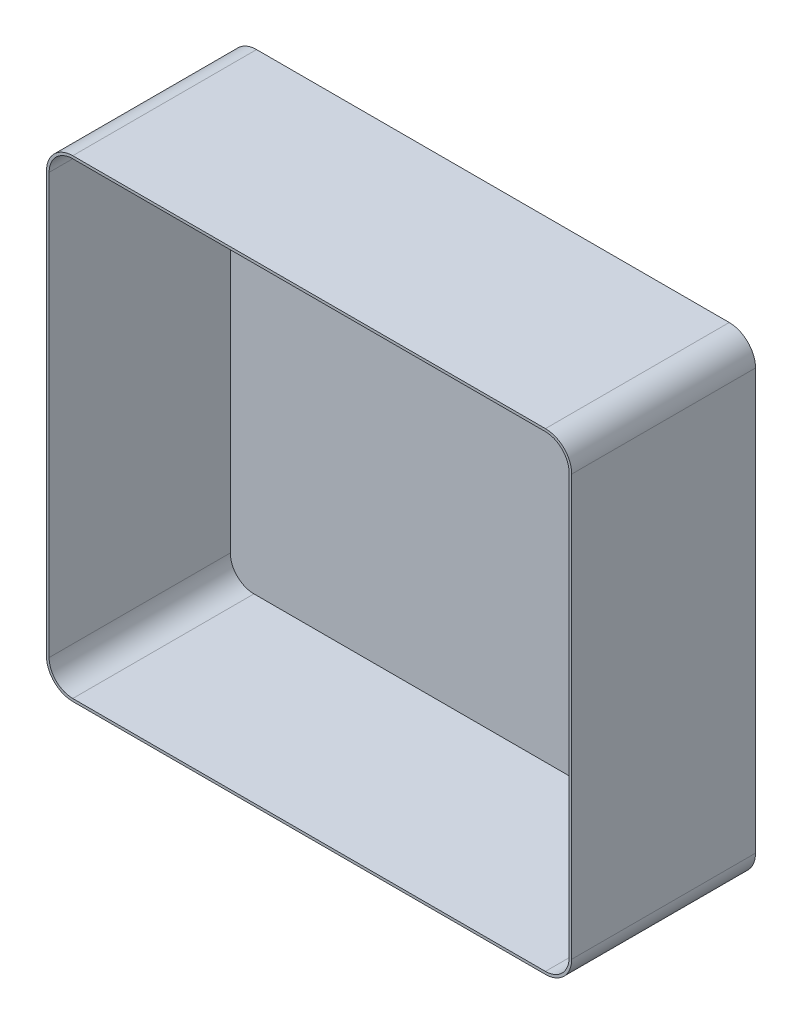
ISO-10303-21;
HEADER;
FILE_DESCRIPTION(('STEP AP214'),'2;1');
FILE_NAME('part.step','',(''),(''),'','','');
FILE_SCHEMA(('AUTOMOTIVE_DESIGN { 1 0 10303 214 1 1 1 1 }'));
ENDSEC;
DATA;
#1=APPLICATION_CONTEXT('core data for automotive mechanical design processes');
#2=APPLICATION_PROTOCOL_DEFINITION('international standard','automotive_design',2000,#1);
#3=PRODUCT_CONTEXT('',#1,'mechanical');
#4=PRODUCT('Part','Part','',(#3));
#5=PRODUCT_RELATED_PRODUCT_CATEGORY('part','',(#4));
#6=PRODUCT_DEFINITION_FORMATION('','',#4);
#7=PRODUCT_DEFINITION_CONTEXT('part definition',#1,'design');
#8=PRODUCT_DEFINITION('design','',#6,#7);
#9=PRODUCT_DEFINITION_SHAPE('','',#8);
#10=(LENGTH_UNIT() NAMED_UNIT(*) SI_UNIT(.MILLI.,.METRE.));
#11=(NAMED_UNIT(*) PLANE_ANGLE_UNIT() SI_UNIT($,.RADIAN.));
#12=(NAMED_UNIT(*) SI_UNIT($,.STERADIAN.) SOLID_ANGLE_UNIT());
#13=UNCERTAINTY_MEASURE_WITH_UNIT(LENGTH_MEASURE(1.E-05),#10,'distance_accuracy_value','');
#14=(GEOMETRIC_REPRESENTATION_CONTEXT(3) GLOBAL_UNCERTAINTY_ASSIGNED_CONTEXT((#13)) GLOBAL_UNIT_ASSIGNED_CONTEXT((#10,
#11,#12)) REPRESENTATION_CONTEXT('',''));
#15=CARTESIAN_POINT('',(0.,0.,0.));
#16=DIRECTION('',(0.,0.,1.));
#17=DIRECTION('',(1.,0.,0.));
#18=AXIS2_PLACEMENT_3D('',#15,#16,#17);
#19=CARTESIAN_POINT('',(90.,-80.,70.));
#20=DIRECTION('',(0.,0.,-1.));
#21=DIRECTION('',(-1.,0.,0.));
#22=AXIS2_PLACEMENT_3D('',#19,#20,#21);
#23=CYLINDRICAL_SURFACE('',#22,9.99999999999999);
#24=CARTESIAN_POINT('',(90.,-80.,0.));
#25=DIRECTION('',(0.,0.,1.));
#26=DIRECTION('',(1.,0.,0.));
#27=AXIS2_PLACEMENT_3D('',#24,#25,#26);
#28=CIRCLE('',#27,9.99999999999999);
#29=CARTESIAN_POINT('',(89.9999999999999,-90.,0.));
#30=VERTEX_POINT('',#29);
#31=CARTESIAN_POINT('',(100.,-79.9999999999999,0.));
#32=VERTEX_POINT('',#31);
#33=EDGE_CURVE('E153',#30,#32,#28,.T.);
#34=ORIENTED_EDGE('',*,*,#33,.T.);
#35=DIRECTION('',(0.,0.,-1.));
#36=VECTOR('',#35,1.);
#37=CARTESIAN_POINT('',(100.,-79.9999999999999,70.));
#38=LINE('',#37,#36);
#39=CARTESIAN_POINT('',(100.,-79.9999999999999,70.));
#40=VERTEX_POINT('',#39);
#41=EDGE_CURVE('E11',#40,#32,#38,.T.);
#42=ORIENTED_EDGE('',*,*,#41,.F.);
#43=CARTESIAN_POINT('',(90.,-80.,70.));
#44=DIRECTION('',(0.,0.,1.));
#45=DIRECTION('',(1.,0.,0.));
#46=AXIS2_PLACEMENT_3D('',#43,#44,#45);
#47=CIRCLE('',#46,9.99999999999999);
#48=CARTESIAN_POINT('',(89.9999999999999,-90.,70.));
#49=VERTEX_POINT('',#48);
#50=EDGE_CURVE('E181',#49,#40,#47,.T.);
#51=ORIENTED_EDGE('',*,*,#50,.F.);
#52=DIRECTION('',(0.,0.,-1.));
#53=VECTOR('',#52,1.);
#54=CARTESIAN_POINT('',(89.9999999999999,-90.,70.));
#55=LINE('',#54,#53);
#56=EDGE_CURVE('E149',#49,#30,#55,.T.);
#57=ORIENTED_EDGE('',*,*,#56,.T.);
#58=EDGE_LOOP('',(#34,#42,#51,#57));
#59=FACE_BOUND('',#58,.T.);
#60=ADVANCED_FACE('F41',(#59),#23,.T.);
#61=CARTESIAN_POINT('',(100.,0.,70.));
#62=DIRECTION('',(-1.,0.,0.));
#63=DIRECTION('',(0.,-1.,0.));
#64=AXIS2_PLACEMENT_3D('',#61,#62,#63);
#65=PLANE('',#64);
#66=DIRECTION('',(0.,1.,0.));
#67=VECTOR('',#66,1.);
#68=CARTESIAN_POINT('',(100.,0.,0.));
#69=LINE('',#68,#67);
#70=CARTESIAN_POINT('',(100.,79.9999999999999,0.));
#71=VERTEX_POINT('',#70);
#72=EDGE_CURVE('E157',#32,#71,#69,.T.);
#73=ORIENTED_EDGE('',*,*,#72,.T.);
#74=DIRECTION('',(0.,0.,-1.));
#75=VECTOR('',#74,1.);
#76=CARTESIAN_POINT('',(100.,79.9999999999999,70.));
#77=LINE('',#76,#75);
#78=CARTESIAN_POINT('',(100.,79.9999999999999,70.));
#79=VERTEX_POINT('',#78);
#80=EDGE_CURVE('E49',#79,#71,#77,.T.);
#81=ORIENTED_EDGE('',*,*,#80,.F.);
#82=DIRECTION('',(0.,1.,0.));
#83=VECTOR('',#82,1.);
#84=CARTESIAN_POINT('',(100.,0.,70.));
#85=LINE('',#84,#83);
#86=EDGE_CURVE('E106',#40,#79,#85,.T.);
#87=ORIENTED_EDGE('',*,*,#86,.F.);
#88=ORIENTED_EDGE('',*,*,#41,.T.);
#89=EDGE_LOOP('',(#73,#81,#87,#88));
#90=FACE_BOUND('',#89,.T.);
#91=ADVANCED_FACE('F200',(#90),#65,.F.);
#92=CARTESIAN_POINT('',(90.,80.,70.));
#93=DIRECTION('',(0.,0.,-1.));
#94=DIRECTION('',(-1.,0.,0.));
#95=AXIS2_PLACEMENT_3D('',#92,#93,#94);
#96=CYLINDRICAL_SURFACE('',#95,9.99999999999999);
#97=CARTESIAN_POINT('',(90.,80.,0.));
#98=DIRECTION('',(0.,0.,1.));
#99=DIRECTION('',(1.,0.,0.));
#100=AXIS2_PLACEMENT_3D('',#97,#98,#99);
#101=CIRCLE('',#100,9.99999999999999);
#102=CARTESIAN_POINT('',(89.9999999999999,90.,0.));
#103=VERTEX_POINT('',#102);
#104=EDGE_CURVE('E162',#103,#71,#101,.F.);
#105=ORIENTED_EDGE('',*,*,#104,.F.);
#106=DIRECTION('',(0.,0.,-1.));
#107=VECTOR('',#106,1.);
#108=CARTESIAN_POINT('',(89.9999999999999,90.,70.));
#109=LINE('',#108,#107);
#110=CARTESIAN_POINT('',(89.9999999999999,90.,70.));
#111=VERTEX_POINT('',#110);
#112=EDGE_CURVE('E191',#111,#103,#109,.T.);
#113=ORIENTED_EDGE('',*,*,#112,.F.);
#114=CARTESIAN_POINT('',(90.,80.,70.));
#115=DIRECTION('',(0.,0.,1.));
#116=DIRECTION('',(1.,0.,0.));
#117=AXIS2_PLACEMENT_3D('',#114,#115,#116);
#118=CIRCLE('',#117,9.99999999999999);
#119=EDGE_CURVE('E199',#111,#79,#118,.F.);
#120=ORIENTED_EDGE('',*,*,#119,.T.);
#121=ORIENTED_EDGE('',*,*,#80,.T.);
#122=EDGE_LOOP('',(#105,#113,#120,#121));
#123=FACE_BOUND('',#122,.T.);
#124=ADVANCED_FACE('F197',(#123),#96,.T.);
#125=CARTESIAN_POINT('',(0.,90.,70.));
#126=DIRECTION('',(0.,1.,0.));
#127=DIRECTION('',(0.,0.,1.));
#128=AXIS2_PLACEMENT_3D('',#125,#126,#127);
#129=PLANE('',#128);
#130=DIRECTION('',(1.,0.,0.));
#131=VECTOR('',#130,1.);
#132=CARTESIAN_POINT('',(0.,90.,0.));
#133=LINE('',#132,#131);
#134=CARTESIAN_POINT('',(-89.9999999999999,90.,0.));
#135=VERTEX_POINT('',#134);
#136=EDGE_CURVE('E166',#135,#103,#133,.T.);
#137=ORIENTED_EDGE('',*,*,#136,.F.);
#138=DIRECTION('',(0.,0.,-1.));
#139=VECTOR('',#138,1.);
#140=CARTESIAN_POINT('',(-89.9999999999999,90.,70.));
#141=LINE('',#140,#139);
#142=CARTESIAN_POINT('',(-89.9999999999999,90.,70.));
#143=VERTEX_POINT('',#142);
#144=EDGE_CURVE('E188',#143,#135,#141,.T.);
#145=ORIENTED_EDGE('',*,*,#144,.F.);
#146=DIRECTION('',(1.,0.,0.));
#147=VECTOR('',#146,1.);
#148=CARTESIAN_POINT('',(0.,90.,70.));
#149=LINE('',#148,#147);
#150=EDGE_CURVE('E210',#143,#111,#149,.T.);
#151=ORIENTED_EDGE('',*,*,#150,.T.);
#152=ORIENTED_EDGE('',*,*,#112,.T.);
#153=EDGE_LOOP('',(#137,#145,#151,#152));
#154=FACE_BOUND('',#153,.T.);
#155=ADVANCED_FACE('F208',(#154),#129,.T.);
#156=CARTESIAN_POINT('',(-90.,80.,70.));
#157=DIRECTION('',(0.,0.,-1.));
#158=DIRECTION('',(-1.,0.,0.));
#159=AXIS2_PLACEMENT_3D('',#156,#157,#158);
#160=CYLINDRICAL_SURFACE('',#159,9.99999999999999);
#161=CARTESIAN_POINT('',(-90.,80.,0.));
#162=DIRECTION('',(0.,0.,1.));
#163=DIRECTION('',(1.,0.,0.));
#164=AXIS2_PLACEMENT_3D('',#161,#162,#163);
#165=CIRCLE('',#164,9.99999999999999);
#166=CARTESIAN_POINT('',(-100.,79.9999999999999,0.));
#167=VERTEX_POINT('',#166);
#168=EDGE_CURVE('E170',#167,#135,#165,.F.);
#169=ORIENTED_EDGE('',*,*,#168,.F.);
#170=DIRECTION('',(0.,0.,-1.));
#171=VECTOR('',#170,1.);
#172=CARTESIAN_POINT('',(-100.,79.9999999999999,70.));
#173=LINE('',#172,#171);
#174=CARTESIAN_POINT('',(-100.,79.9999999999999,70.));
#175=VERTEX_POINT('',#174);
#176=EDGE_CURVE('E134',#175,#167,#173,.T.);
#177=ORIENTED_EDGE('',*,*,#176,.F.);
#178=CARTESIAN_POINT('',(-90.,80.,70.));
#179=DIRECTION('',(0.,0.,1.));
#180=DIRECTION('',(1.,0.,0.));
#181=AXIS2_PLACEMENT_3D('',#178,#179,#180);
#182=CIRCLE('',#181,9.99999999999999);
#183=EDGE_CURVE('E142',#175,#143,#182,.F.);
#184=ORIENTED_EDGE('',*,*,#183,.T.);
#185=ORIENTED_EDGE('',*,*,#144,.T.);
#186=EDGE_LOOP('',(#169,#177,#184,#185));
#187=FACE_BOUND('',#186,.T.);
#188=ADVANCED_FACE('F220',(#187),#160,.T.);
#189=CARTESIAN_POINT('',(-100.,0.,70.));
#190=DIRECTION('',(-1.,0.,0.));
#191=DIRECTION('',(0.,0.,1.));
#192=AXIS2_PLACEMENT_3D('',#189,#190,#191);
#193=PLANE('',#192);
#194=DIRECTION('',(0.,1.,0.));
#195=VECTOR('',#194,1.);
#196=CARTESIAN_POINT('',(-100.,0.,0.));
#197=LINE('',#196,#195);
#198=CARTESIAN_POINT('',(-100.,-79.9999999999999,0.));
#199=VERTEX_POINT('',#198);
#200=EDGE_CURVE('E128',#199,#167,#197,.T.);
#201=ORIENTED_EDGE('',*,*,#200,.F.);
#202=DIRECTION('',(0.,0.,-1.));
#203=VECTOR('',#202,1.);
#204=CARTESIAN_POINT('',(-100.,-79.9999999999999,70.));
#205=LINE('',#204,#203);
#206=CARTESIAN_POINT('',(-100.,-79.9999999999999,70.));
#207=VERTEX_POINT('',#206);
#208=EDGE_CURVE('E123',#207,#199,#205,.T.);
#209=ORIENTED_EDGE('',*,*,#208,.F.);
#210=DIRECTION('',(0.,1.,0.));
#211=VECTOR('',#210,1.);
#212=CARTESIAN_POINT('',(-100.,0.,70.));
#213=LINE('',#212,#211);
#214=EDGE_CURVE('E126',#207,#175,#213,.T.);
#215=ORIENTED_EDGE('',*,*,#214,.T.);
#216=ORIENTED_EDGE('',*,*,#176,.T.);
#217=EDGE_LOOP('',(#201,#209,#215,#216));
#218=FACE_BOUND('',#217,.T.);
#219=ADVANCED_FACE('F125',(#218),#193,.T.);
#220=CARTESIAN_POINT('',(-90.,-80.,70.));
#221=DIRECTION('',(0.,0.,-1.));
#222=DIRECTION('',(-1.,0.,0.));
#223=AXIS2_PLACEMENT_3D('',#220,#221,#222);
#224=CYLINDRICAL_SURFACE('',#223,9.99999999999999);
#225=CARTESIAN_POINT('',(-90.,-80.,0.));
#226=DIRECTION('',(0.,0.,1.));
#227=DIRECTION('',(1.,0.,0.));
#228=AXIS2_PLACEMENT_3D('',#225,#226,#227);
#229=CIRCLE('',#228,9.99999999999999);
#230=CARTESIAN_POINT('',(-89.9999999999999,-90.,0.));
#231=VERTEX_POINT('',#230);
#232=EDGE_CURVE('E176',#231,#199,#229,.F.);
#233=ORIENTED_EDGE('',*,*,#232,.F.);
#234=DIRECTION('',(0.,0.,-1.));
#235=VECTOR('',#234,1.);
#236=CARTESIAN_POINT('',(-89.9999999999999,-90.,70.));
#237=LINE('',#236,#235);
#238=CARTESIAN_POINT('',(-89.9999999999999,-90.,70.));
#239=VERTEX_POINT('',#238);
#240=EDGE_CURVE('E135',#239,#231,#237,.T.);
#241=ORIENTED_EDGE('',*,*,#240,.F.);
#242=CARTESIAN_POINT('',(-90.,-80.,70.));
#243=DIRECTION('',(0.,0.,1.));
#244=DIRECTION('',(1.,0.,0.));
#245=AXIS2_PLACEMENT_3D('',#242,#243,#244);
#246=CIRCLE('',#245,9.99999999999999);
#247=EDGE_CURVE('E139',#239,#207,#246,.F.);
#248=ORIENTED_EDGE('',*,*,#247,.T.);
#249=ORIENTED_EDGE('',*,*,#208,.T.);
#250=EDGE_LOOP('',(#233,#241,#248,#249));
#251=FACE_BOUND('',#250,.T.);
#252=ADVANCED_FACE('F145',(#251),#224,.T.);
#253=CARTESIAN_POINT('',(0.,-90.,70.));
#254=DIRECTION('',(0.,1.,0.));
#255=DIRECTION('',(-1.,0.,0.));
#256=AXIS2_PLACEMENT_3D('',#253,#254,#255);
#257=PLANE('',#256);
#258=DIRECTION('',(1.,0.,0.));
#259=VECTOR('',#258,1.);
#260=CARTESIAN_POINT('',(0.,-90.,0.));
#261=LINE('',#260,#259);
#262=EDGE_CURVE('E98',#231,#30,#261,.T.);
#263=ORIENTED_EDGE('',*,*,#262,.T.);
#264=ORIENTED_EDGE('',*,*,#56,.F.);
#265=DIRECTION('',(1.,0.,0.));
#266=VECTOR('',#265,1.);
#267=CARTESIAN_POINT('',(0.,-90.,70.));
#268=LINE('',#267,#266);
#269=EDGE_CURVE('E65',#239,#49,#268,.T.);
#270=ORIENTED_EDGE('',*,*,#269,.F.);
#271=ORIENTED_EDGE('',*,*,#240,.T.);
#272=EDGE_LOOP('',(#263,#264,#270,#271));
#273=FACE_BOUND('',#272,.T.);
#274=ADVANCED_FACE('F223',(#273),#257,.F.);
#275=CARTESIAN_POINT('',(0.,0.,70.));
#276=DIRECTION('',(0.,0.,1.));
#277=DIRECTION('',(1.,0.,0.));
#278=AXIS2_PLACEMENT_3D('',#275,#276,#277);
#279=PLANE('',#278);
#280=CARTESIAN_POINT('',(90.,-80.,70.));
#281=DIRECTION('',(0.,0.,1.));
#282=DIRECTION('',(1.,0.,0.));
#283=AXIS2_PLACEMENT_3D('',#280,#281,#282);
#284=CIRCLE('',#283,8.99999999999999);
#285=CARTESIAN_POINT('',(89.9999999999999,-89.,70.));
#286=VERTEX_POINT('',#285);
#287=CARTESIAN_POINT('',(99.,-79.9999999999999,70.));
#288=VERTEX_POINT('',#287);
#289=EDGE_CURVE('E453',#286,#288,#284,.T.);
#290=ORIENTED_EDGE('',*,*,#289,.F.);
#291=DIRECTION('',(1.,0.,0.));
#292=VECTOR('',#291,1.);
#293=CARTESIAN_POINT('',(0.,-89.,70.));
#294=LINE('',#293,#292);
#295=CARTESIAN_POINT('',(-89.9999999999999,-89.,70.));
#296=VERTEX_POINT('',#295);
#297=EDGE_CURVE('E410',#296,#286,#294,.T.);
#298=ORIENTED_EDGE('',*,*,#297,.F.);
#299=CARTESIAN_POINT('',(-90.,-80.,70.));
#300=DIRECTION('',(0.,0.,1.));
#301=DIRECTION('',(1.,0.,0.));
#302=AXIS2_PLACEMENT_3D('',#299,#300,#301);
#303=CIRCLE('',#302,8.99999999999999);
#304=CARTESIAN_POINT('',(-99.,-79.9999999999999,70.));
#305=VERTEX_POINT('',#304);
#306=EDGE_CURVE('E56',#296,#305,#303,.F.);
#307=ORIENTED_EDGE('',*,*,#306,.T.);
#308=DIRECTION('',(0.,1.,0.));
#309=VECTOR('',#308,1.);
#310=CARTESIAN_POINT('',(-99.,0.,70.));
#311=LINE('',#310,#309);
#312=CARTESIAN_POINT('',(-99.,79.9999999999999,70.));
#313=VERTEX_POINT('',#312);
#314=EDGE_CURVE('E473',#305,#313,#311,.T.);
#315=ORIENTED_EDGE('',*,*,#314,.T.);
#316=CARTESIAN_POINT('',(-90.,80.,70.));
#317=DIRECTION('',(0.,0.,1.));
#318=DIRECTION('',(1.,0.,0.));
#319=AXIS2_PLACEMENT_3D('',#316,#317,#318);
#320=CIRCLE('',#319,8.99999999999999);
#321=CARTESIAN_POINT('',(-89.9999999999999,89.,70.));
#322=VERTEX_POINT('',#321);
#323=EDGE_CURVE('E469',#313,#322,#320,.F.);
#324=ORIENTED_EDGE('',*,*,#323,.T.);
#325=DIRECTION('',(1.,0.,0.));
#326=VECTOR('',#325,1.);
#327=CARTESIAN_POINT('',(0.,89.,70.));
#328=LINE('',#327,#326);
#329=CARTESIAN_POINT('',(89.9999999999999,89.,70.));
#330=VERTEX_POINT('',#329);
#331=EDGE_CURVE('E465',#322,#330,#328,.T.);
#332=ORIENTED_EDGE('',*,*,#331,.T.);
#333=CARTESIAN_POINT('',(90.,80.,70.));
#334=DIRECTION('',(0.,0.,1.));
#335=DIRECTION('',(1.,0.,0.));
#336=AXIS2_PLACEMENT_3D('',#333,#334,#335);
#337=CIRCLE('',#336,8.99999999999999);
#338=CARTESIAN_POINT('',(99.,79.9999999999999,70.));
#339=VERTEX_POINT('',#338);
#340=EDGE_CURVE('E461',#330,#339,#337,.F.);
#341=ORIENTED_EDGE('',*,*,#340,.T.);
#342=DIRECTION('',(0.,1.,0.));
#343=VECTOR('',#342,1.);
#344=CARTESIAN_POINT('',(99.,0.,70.));
#345=LINE('',#344,#343);
#346=EDGE_CURVE('E457',#288,#339,#345,.T.);
#347=ORIENTED_EDGE('',*,*,#346,.F.);
#348=EDGE_LOOP('',(#290,#298,#307,#315,#324,#332,#341,#347));
#349=FACE_BOUND('',#348,.T.);
#350=ORIENTED_EDGE('',*,*,#50,.T.);
#351=ORIENTED_EDGE('',*,*,#86,.T.);
#352=ORIENTED_EDGE('',*,*,#119,.F.);
#353=ORIENTED_EDGE('',*,*,#150,.F.);
#354=ORIENTED_EDGE('',*,*,#183,.F.);
#355=ORIENTED_EDGE('',*,*,#214,.F.);
#356=ORIENTED_EDGE('',*,*,#247,.F.);
#357=ORIENTED_EDGE('',*,*,#269,.T.);
#358=EDGE_LOOP('',(#350,#351,#352,#353,#354,#355,#356,#357));
#359=FACE_BOUND('',#358,.T.);
#360=ADVANCED_FACE('F138',(#349,#359),#279,.T.);
#361=CARTESIAN_POINT('',(0.,0.,0.));
#362=DIRECTION('',(0.,0.,1.));
#363=DIRECTION('',(1.,0.,0.));
#364=AXIS2_PLACEMENT_3D('',#361,#362,#363);
#365=PLANE('',#364);
#366=ORIENTED_EDGE('',*,*,#33,.F.);
#367=ORIENTED_EDGE('',*,*,#262,.F.);
#368=ORIENTED_EDGE('',*,*,#232,.T.);
#369=ORIENTED_EDGE('',*,*,#200,.T.);
#370=ORIENTED_EDGE('',*,*,#168,.T.);
#371=ORIENTED_EDGE('',*,*,#136,.T.);
#372=ORIENTED_EDGE('',*,*,#104,.T.);
#373=ORIENTED_EDGE('',*,*,#72,.F.);
#374=EDGE_LOOP('',(#366,#367,#368,#369,#370,#371,#372,#373));
#375=FACE_BOUND('',#374,.T.);
#376=ADVANCED_FACE('F204',(#375),#365,.F.);
#377=CARTESIAN_POINT('',(90.,-80.,70.));
#378=DIRECTION('',(0.,0.,-1.));
#379=DIRECTION('',(-1.,0.,0.));
#380=AXIS2_PLACEMENT_3D('',#377,#378,#379);
#381=CYLINDRICAL_SURFACE('',#380,8.99999999999999);
#382=CARTESIAN_POINT('',(90.,-80.,1.));
#383=DIRECTION('',(0.,0.,1.));
#384=DIRECTION('',(1.,0.,0.));
#385=AXIS2_PLACEMENT_3D('',#382,#383,#384);
#386=CIRCLE('',#385,8.99999999999999);
#387=CARTESIAN_POINT('',(89.9999999999999,-89.,1.));
#388=VERTEX_POINT('',#387);
#389=CARTESIAN_POINT('',(99.,-79.9999999999999,1.));
#390=VERTEX_POINT('',#389);
#391=EDGE_CURVE('E384',#388,#390,#386,.T.);
#392=ORIENTED_EDGE('',*,*,#391,.F.);
#393=DIRECTION('',(0.,0.,-1.));
#394=VECTOR('',#393,1.);
#395=CARTESIAN_POINT('',(89.9999999999999,-89.,70.));
#396=LINE('',#395,#394);
#397=EDGE_CURVE('E407',#286,#388,#396,.T.);
#398=ORIENTED_EDGE('',*,*,#397,.F.);
#399=ORIENTED_EDGE('',*,*,#289,.T.);
#400=DIRECTION('',(0.,0.,1.));
#401=VECTOR('',#400,1.);
#402=CARTESIAN_POINT('',(99.,-79.9999999999999,70.));
#403=LINE('',#402,#401);
#404=EDGE_CURVE('E158',#288,#390,#403,.F.);
#405=ORIENTED_EDGE('',*,*,#404,.T.);
#406=EDGE_LOOP('',(#392,#398,#399,#405));
#407=FACE_BOUND('',#406,.T.);
#408=ADVANCED_FACE('F270',(#407),#381,.F.);
#409=CARTESIAN_POINT('',(99.,0.,70.));
#410=DIRECTION('',(-1.,0.,0.));
#411=DIRECTION('',(0.,-1.,0.));
#412=AXIS2_PLACEMENT_3D('',#409,#410,#411);
#413=PLANE('',#412);
#414=DIRECTION('',(0.,1.,0.));
#415=VECTOR('',#414,1.);
#416=CARTESIAN_POINT('',(99.,0.,1.));
#417=LINE('',#416,#415);
#418=CARTESIAN_POINT('',(99.,79.9999999999999,1.));
#419=VERTEX_POINT('',#418);
#420=EDGE_CURVE('E388',#390,#419,#417,.T.);
#421=ORIENTED_EDGE('',*,*,#420,.F.);
#422=ORIENTED_EDGE('',*,*,#404,.F.);
#423=ORIENTED_EDGE('',*,*,#346,.T.);
#424=DIRECTION('',(0.,0.,-1.));
#425=VECTOR('',#424,1.);
#426=CARTESIAN_POINT('',(99.,79.9999999999999,70.));
#427=LINE('',#426,#425);
#428=EDGE_CURVE('E406',#339,#419,#427,.T.);
#429=ORIENTED_EDGE('',*,*,#428,.T.);
#430=EDGE_LOOP('',(#421,#422,#423,#429));
#431=FACE_BOUND('',#430,.T.);
#432=ADVANCED_FACE('F287',(#431),#413,.T.);
#433=CARTESIAN_POINT('',(90.,80.,70.));
#434=DIRECTION('',(0.,0.,-1.));
#435=DIRECTION('',(-1.,0.,0.));
#436=AXIS2_PLACEMENT_3D('',#433,#434,#435);
#437=CYLINDRICAL_SURFACE('',#436,8.99999999999999);
#438=CARTESIAN_POINT('',(90.,80.,1.));
#439=DIRECTION('',(0.,0.,1.));
#440=DIRECTION('',(1.,0.,0.));
#441=AXIS2_PLACEMENT_3D('',#438,#439,#440);
#442=CIRCLE('',#441,8.99999999999999);
#443=CARTESIAN_POINT('',(89.9999999999999,89.,1.));
#444=VERTEX_POINT('',#443);
#445=EDGE_CURVE('E401',#444,#419,#442,.F.);
#446=ORIENTED_EDGE('',*,*,#445,.T.);
#447=ORIENTED_EDGE('',*,*,#428,.F.);
#448=ORIENTED_EDGE('',*,*,#340,.F.);
#449=DIRECTION('',(0.,0.,1.));
#450=VECTOR('',#449,1.);
#451=CARTESIAN_POINT('',(89.9999999999999,89.,70.));
#452=LINE('',#451,#450);
#453=EDGE_CURVE('E415',#330,#444,#452,.F.);
#454=ORIENTED_EDGE('',*,*,#453,.T.);
#455=EDGE_LOOP('',(#446,#447,#448,#454));
#456=FACE_BOUND('',#455,.T.);
#457=ADVANCED_FACE('F297',(#456),#437,.F.);
#458=CARTESIAN_POINT('',(0.,89.,70.));
#459=DIRECTION('',(0.,1.,0.));
#460=DIRECTION('',(0.,0.,1.));
#461=AXIS2_PLACEMENT_3D('',#458,#459,#460);
#462=PLANE('',#461);
#463=DIRECTION('',(1.,0.,0.));
#464=VECTOR('',#463,1.);
#465=CARTESIAN_POINT('',(0.,89.,1.));
#466=LINE('',#465,#464);
#467=CARTESIAN_POINT('',(-89.9999999999999,89.,1.));
#468=VERTEX_POINT('',#467);
#469=EDGE_CURVE('E418',#468,#444,#466,.T.);
#470=ORIENTED_EDGE('',*,*,#469,.T.);
#471=ORIENTED_EDGE('',*,*,#453,.F.);
#472=ORIENTED_EDGE('',*,*,#331,.F.);
#473=DIRECTION('',(0.,0.,-1.));
#474=VECTOR('',#473,1.);
#475=CARTESIAN_POINT('',(-89.9999999999999,89.,70.));
#476=LINE('',#475,#474);
#477=EDGE_CURVE('E422',#322,#468,#476,.T.);
#478=ORIENTED_EDGE('',*,*,#477,.T.);
#479=EDGE_LOOP('',(#470,#471,#472,#478));
#480=FACE_BOUND('',#479,.T.);
#481=ADVANCED_FACE('F307',(#480),#462,.F.);
#482=CARTESIAN_POINT('',(-90.,80.,70.));
#483=DIRECTION('',(0.,0.,-1.));
#484=DIRECTION('',(-1.,0.,0.));
#485=AXIS2_PLACEMENT_3D('',#482,#483,#484);
#486=CYLINDRICAL_SURFACE('',#485,8.99999999999999);
#487=CARTESIAN_POINT('',(-90.,80.,1.));
#488=DIRECTION('',(0.,0.,1.));
#489=DIRECTION('',(1.,0.,0.));
#490=AXIS2_PLACEMENT_3D('',#487,#488,#489);
#491=CIRCLE('',#490,8.99999999999999);
#492=CARTESIAN_POINT('',(-99.,79.9999999999999,1.));
#493=VERTEX_POINT('',#492);
#494=EDGE_CURVE('E426',#493,#468,#491,.F.);
#495=ORIENTED_EDGE('',*,*,#494,.T.);
#496=ORIENTED_EDGE('',*,*,#477,.F.);
#497=ORIENTED_EDGE('',*,*,#323,.F.);
#498=DIRECTION('',(0.,0.,1.));
#499=VECTOR('',#498,1.);
#500=CARTESIAN_POINT('',(-99.,79.9999999999999,70.));
#501=LINE('',#500,#499);
#502=EDGE_CURVE('E430',#313,#493,#501,.F.);
#503=ORIENTED_EDGE('',*,*,#502,.T.);
#504=EDGE_LOOP('',(#495,#496,#497,#503));
#505=FACE_BOUND('',#504,.T.);
#506=ADVANCED_FACE('F317',(#505),#486,.F.);
#507=CARTESIAN_POINT('',(-99.,0.,70.));
#508=DIRECTION('',(-1.,0.,0.));
#509=DIRECTION('',(0.,0.,1.));
#510=AXIS2_PLACEMENT_3D('',#507,#508,#509);
#511=PLANE('',#510);
#512=DIRECTION('',(0.,1.,0.));
#513=VECTOR('',#512,1.);
#514=CARTESIAN_POINT('',(-99.,0.,1.));
#515=LINE('',#514,#513);
#516=CARTESIAN_POINT('',(-99.,-79.9999999999999,1.));
#517=VERTEX_POINT('',#516);
#518=EDGE_CURVE('E434',#517,#493,#515,.T.);
#519=ORIENTED_EDGE('',*,*,#518,.T.);
#520=ORIENTED_EDGE('',*,*,#502,.F.);
#521=ORIENTED_EDGE('',*,*,#314,.F.);
#522=DIRECTION('',(0.,0.,-1.));
#523=VECTOR('',#522,1.);
#524=CARTESIAN_POINT('',(-99.,-79.9999999999999,70.));
#525=LINE('',#524,#523);
#526=EDGE_CURVE('E438',#305,#517,#525,.T.);
#527=ORIENTED_EDGE('',*,*,#526,.T.);
#528=EDGE_LOOP('',(#519,#520,#521,#527));
#529=FACE_BOUND('',#528,.T.);
#530=ADVANCED_FACE('F327',(#529),#511,.F.);
#531=CARTESIAN_POINT('',(-90.,-80.,70.));
#532=DIRECTION('',(0.,0.,-1.));
#533=DIRECTION('',(-1.,0.,0.));
#534=AXIS2_PLACEMENT_3D('',#531,#532,#533);
#535=CYLINDRICAL_SURFACE('',#534,8.99999999999999);
#536=CARTESIAN_POINT('',(-90.,-80.,1.));
#537=DIRECTION('',(0.,0.,1.));
#538=DIRECTION('',(1.,0.,0.));
#539=AXIS2_PLACEMENT_3D('',#536,#537,#538);
#540=CIRCLE('',#539,8.99999999999999);
#541=CARTESIAN_POINT('',(-89.9999999999999,-89.,1.));
#542=VERTEX_POINT('',#541);
#543=EDGE_CURVE('E442',#542,#517,#540,.F.);
#544=ORIENTED_EDGE('',*,*,#543,.T.);
#545=ORIENTED_EDGE('',*,*,#526,.F.);
#546=ORIENTED_EDGE('',*,*,#306,.F.);
#547=DIRECTION('',(0.,0.,1.));
#548=VECTOR('',#547,1.);
#549=CARTESIAN_POINT('',(-89.9999999999999,-89.,70.));
#550=LINE('',#549,#548);
#551=EDGE_CURVE('E409',#296,#542,#550,.F.);
#552=ORIENTED_EDGE('',*,*,#551,.T.);
#553=EDGE_LOOP('',(#544,#545,#546,#552));
#554=FACE_BOUND('',#553,.T.);
#555=ADVANCED_FACE('F337',(#554),#535,.F.);
#556=CARTESIAN_POINT('',(0.,-89.,70.));
#557=DIRECTION('',(0.,1.,0.));
#558=DIRECTION('',(-1.,0.,0.));
#559=AXIS2_PLACEMENT_3D('',#556,#557,#558);
#560=PLANE('',#559);
#561=DIRECTION('',(1.,0.,0.));
#562=VECTOR('',#561,1.);
#563=CARTESIAN_POINT('',(0.,-89.,1.));
#564=LINE('',#563,#562);
#565=EDGE_CURVE('E393',#542,#388,#564,.T.);
#566=ORIENTED_EDGE('',*,*,#565,.F.);
#567=ORIENTED_EDGE('',*,*,#551,.F.);
#568=ORIENTED_EDGE('',*,*,#297,.T.);
#569=ORIENTED_EDGE('',*,*,#397,.T.);
#570=EDGE_LOOP('',(#566,#567,#568,#569));
#571=FACE_BOUND('',#570,.T.);
#572=ADVANCED_FACE('F347',(#571),#560,.T.);
#573=CARTESIAN_POINT('',(0.,0.,1.));
#574=DIRECTION('',(0.,0.,1.));
#575=DIRECTION('',(1.,0.,0.));
#576=AXIS2_PLACEMENT_3D('',#573,#574,#575);
#577=PLANE('',#576);
#578=ORIENTED_EDGE('',*,*,#391,.T.);
#579=ORIENTED_EDGE('',*,*,#420,.T.);
#580=ORIENTED_EDGE('',*,*,#445,.F.);
#581=ORIENTED_EDGE('',*,*,#469,.F.);
#582=ORIENTED_EDGE('',*,*,#494,.F.);
#583=ORIENTED_EDGE('',*,*,#518,.F.);
#584=ORIENTED_EDGE('',*,*,#543,.F.);
#585=ORIENTED_EDGE('',*,*,#565,.T.);
#586=EDGE_LOOP('',(#578,#579,#580,#581,#582,#583,#584,#585));
#587=FACE_BOUND('',#586,.T.);
#588=ADVANCED_FACE('F356',(#587),#577,.T.);
#589=CLOSED_SHELL('',(#60,#91,#124,#155,#188,#219,#252,#274,#360,#376,#408,#432,#457,#481,#506,
#530,#555,#572,#588));
#590=MANIFOLD_SOLID_BREP('B2',#589);
#591=ADVANCED_BREP_SHAPE_REPRESENTATION('',(#18,#590),#14);
#592=SHAPE_DEFINITION_REPRESENTATION(#9,#591);
ENDSEC;
END-ISO-10303-21;
